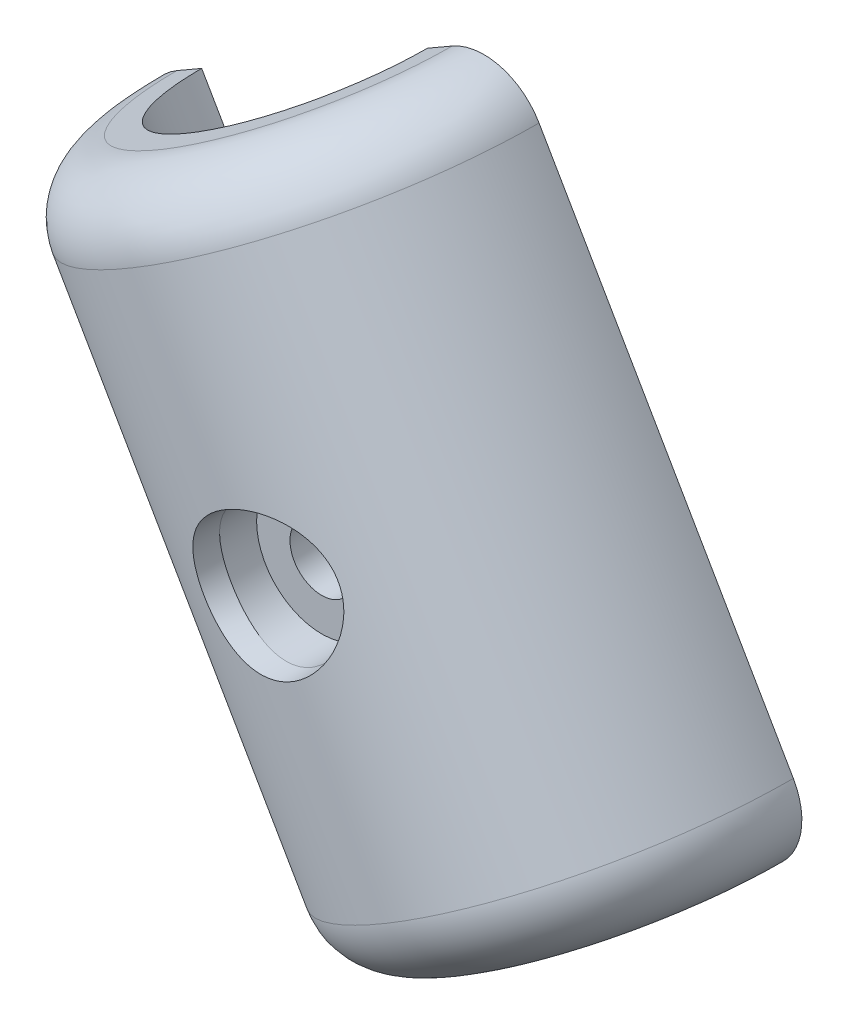
ISO-10303-21;
HEADER;
FILE_DESCRIPTION(('STEP AP214'),'2;1');
FILE_NAME('part.step','',(''),(''),'','','');
FILE_SCHEMA(('AUTOMOTIVE_DESIGN { 1 0 10303 214 1 1 1 1 }'));
ENDSEC;
DATA;
#1=APPLICATION_CONTEXT('core data for automotive mechanical design processes');
#2=APPLICATION_PROTOCOL_DEFINITION('international standard','automotive_design',2000,#1);
#3=PRODUCT_CONTEXT('',#1,'mechanical');
#4=PRODUCT('Part','Part','',(#3));
#5=PRODUCT_RELATED_PRODUCT_CATEGORY('part','',(#4));
#6=PRODUCT_DEFINITION_FORMATION('','',#4);
#7=PRODUCT_DEFINITION_CONTEXT('part definition',#1,'design');
#8=PRODUCT_DEFINITION('design','',#6,#7);
#9=PRODUCT_DEFINITION_SHAPE('','',#8);
#10=(LENGTH_UNIT() NAMED_UNIT(*) SI_UNIT(.MILLI.,.METRE.));
#11=(NAMED_UNIT(*) PLANE_ANGLE_UNIT() SI_UNIT($,.RADIAN.));
#12=(NAMED_UNIT(*) SI_UNIT($,.STERADIAN.) SOLID_ANGLE_UNIT());
#13=UNCERTAINTY_MEASURE_WITH_UNIT(LENGTH_MEASURE(1.E-05),#10,'distance_accuracy_value','');
#14=(GEOMETRIC_REPRESENTATION_CONTEXT(3) GLOBAL_UNCERTAINTY_ASSIGNED_CONTEXT((#13)) GLOBAL_UNIT_ASSIGNED_CONTEXT((#10,
#11,#12)) REPRESENTATION_CONTEXT('',''));
#15=CARTESIAN_POINT('',(0.,0.,0.));
#16=DIRECTION('',(0.,0.,1.));
#17=DIRECTION('',(1.,0.,0.));
#18=AXIS2_PLACEMENT_3D('',#15,#16,#17);
#19=CARTESIAN_POINT('',(0.,0.,8.02099309036844));
#20=DIRECTION('',(0.,0.,1.));
#21=DIRECTION('',(1.,0.,0.));
#22=AXIS2_PLACEMENT_3D('',#19,#20,#21);
#23=PLANE('',#22);
#24=DIRECTION('',(0.499999999999989,-0.866025403784445,0.));
#25=VECTOR('',#24,1.);
#26=CARTESIAN_POINT('',(-6.48868439169032,2.56315739652961,8.02099309036844));
#27=LINE('',#26,#25);
#28=CARTESIAN_POINT('',(1.24336641587843,-10.8291474488838,8.02099309036823));
#29=VERTEX_POINT('',#28);
#30=CARTESIAN_POINT('',(-8.75663358412135,6.49136062680508,8.0209930903685));
#31=VERTEX_POINT('',#30);
#32=EDGE_CURVE('E49',#29,#31,#27,.F.);
#33=ORIENTED_EDGE('',*,*,#32,.F.);
#34=DIRECTION('',(-0.866025403784445,-0.499999999999989,0.));
#35=VECTOR('',#34,1.);
#36=CARTESIAN_POINT('',(4.79407057139845,-8.77914744888168,8.02099309036844));
#37=LINE('',#36,#35);
#38=CARTESIAN_POINT('',(0.46394355247622,-11.2791474488816,8.02099309036833));
#39=VERTEX_POINT('',#38);
#40=EDGE_CURVE('E224',#29,#39,#37,.T.);
#41=ORIENTED_EDGE('',*,*,#40,.T.);
#42=CARTESIAN_POINT('',(-0.536056447523757,-9.54709664131274,8.02099309036833));
#43=DIRECTION('',(0.,0.,1.));
#44=DIRECTION('',(1.,0.,0.));
#45=AXIS2_PLACEMENT_3D('',#42,#43,#44);
#46=CIRCLE('',#45,2.);
#47=CARTESIAN_POINT('',(-2.26810725509265,-10.5470966413127,8.02099309036833));
#48=VERTEX_POINT('',#47);
#49=EDGE_CURVE('E54',#39,#48,#46,.F.);
#50=ORIENTED_EDGE('',*,*,#49,.T.);
#51=DIRECTION('',(0.499999999999989,-0.866025403784445,0.));
#52=VECTOR('',#51,1.);
#53=CARTESIAN_POINT('',(-11.2681072550924,5.0413606268073,8.02099309036844));
#54=LINE('',#53,#52);
#55=CARTESIAN_POINT('',(-10.2681072550925,3.30930981923841,8.02099309036855));
#56=VERTEX_POINT('',#55);
#57=EDGE_CURVE('E68',#48,#56,#54,.F.);
#58=ORIENTED_EDGE('',*,*,#57,.T.);
#59=CARTESIAN_POINT('',(-8.53605644752358,4.30930981923839,8.02099309036855));
#60=DIRECTION('',(0.,0.,1.));
#61=DIRECTION('',(1.,0.,0.));
#62=AXIS2_PLACEMENT_3D('',#59,#60,#61);
#63=CIRCLE('',#62,2.);
#64=CARTESIAN_POINT('',(-9.53605644752356,6.04136062680728,8.02099309036855));
#65=VERTEX_POINT('',#64);
#66=EDGE_CURVE('E227',#56,#65,#63,.F.);
#67=ORIENTED_EDGE('',*,*,#66,.T.);
#68=DIRECTION('',(-0.866025403784445,-0.499999999999989,0.));
#69=VECTOR('',#68,1.);
#70=CARTESIAN_POINT('',(-5.20592942860133,8.54136062680722,8.02099309036844));
#71=LINE('',#70,#69);
#72=EDGE_CURVE('E112',#31,#65,#71,.T.);
#73=ORIENTED_EDGE('',*,*,#72,.F.);
#74=EDGE_LOOP('',(#33,#41,#50,#58,#67,#73));
#75=FACE_BOUND('',#74,.T.);
#76=ADVANCED_FACE('F46',(#75),#23,.F.);
#77=CARTESIAN_POINT('',(0.124197590320872,9.30930981923827,8.02099309036855));
#78=DIRECTION('',(0.,0.,1.));
#79=DIRECTION('',(1.,0.,0.));
#80=AXIS2_PLACEMENT_3D('',#77,#78,#79);
#81=CIRCLE('',#80,2.);
#82=CARTESIAN_POINT('',(-0.875802409679106,11.0413606268072,8.02099309036855));
#83=VERTEX_POINT('',#82);
#84=CARTESIAN_POINT('',(1.85624839788976,10.3093098192383,8.02099309036855));
#85=VERTEX_POINT('',#84);
#86=EDGE_CURVE('E223',#83,#85,#81,.F.);
#87=ORIENTED_EDGE('',*,*,#86,.T.);
#88=DIRECTION('',(0.499999999999989,-0.866025403784445,0.));
#89=VECTOR('',#88,1.);
#90=CARTESIAN_POINT('',(0.856248397889784,12.0413606268071,8.02099309036844));
#91=LINE('',#90,#89);
#92=CARTESIAN_POINT('',(9.85624839788958,-3.54709664131287,8.02099309036833));
#93=VERTEX_POINT('',#92);
#94=EDGE_CURVE('E228',#85,#93,#91,.T.);
#95=ORIENTED_EDGE('',*,*,#94,.T.);
#96=CARTESIAN_POINT('',(8.12419759032069,-4.54709664131285,8.02099309036833));
#97=DIRECTION('',(0.,0.,1.));
#98=DIRECTION('',(1.,0.,0.));
#99=AXIS2_PLACEMENT_3D('',#96,#97,#98);
#100=CIRCLE('',#99,2.);
#101=CARTESIAN_POINT('',(9.12419759032067,-6.27914744888174,8.02099309036833));
#102=VERTEX_POINT('',#101);
#103=EDGE_CURVE('E11',#93,#102,#100,.F.);
#104=ORIENTED_EDGE('',*,*,#103,.T.);
#105=CARTESIAN_POINT('',(8.34477472691846,-6.72914744887954,8.02099309036823));
#106=VERTEX_POINT('',#105);
#107=EDGE_CURVE('E117',#102,#106,#37,.T.);
#108=ORIENTED_EDGE('',*,*,#107,.T.);
#109=DIRECTION('',(0.499999999999989,-0.866025403784445,0.));
#110=VECTOR('',#109,1.);
#111=CARTESIAN_POINT('',(0.612723919349714,6.6631573965339,8.02099309036844));
#112=LINE('',#111,#110);
#113=CARTESIAN_POINT('',(-1.65522527308131,10.5913606268094,8.0209930903685));
#114=VERTEX_POINT('',#113);
#115=EDGE_CURVE('E115',#114,#106,#112,.T.);
#116=ORIENTED_EDGE('',*,*,#115,.F.);
#117=EDGE_CURVE('E102',#83,#114,#71,.T.);
#118=ORIENTED_EDGE('',*,*,#117,.F.);
#119=EDGE_LOOP('',(#87,#95,#104,#108,#116,#118));
#120=FACE_BOUND('',#119,.T.);
#121=ADVANCED_FACE('F116',(#120),#23,.F.);
#122=CARTESIAN_POINT('',(-5.20592942860133,8.54136062680722,8.02099309036857));
#123=DIRECTION('',(0.499999999999989,-0.866025403784445,0.));
#124=DIRECTION('',(0.866025403784445,0.499999999999989,0.));
#125=AXIS2_PLACEMENT_3D('',#122,#123,#124);
#126=CYLINDRICAL_SURFACE('',#125,7.);
#127=ORIENTED_EDGE('',*,*,#57,.F.);
#128=CARTESIAN_POINT('',(3.79407057139847,-7.04709664131279,8.02099309036833));
#129=DIRECTION('',(0.499999999999989,-0.866025403784445,0.));
#130=DIRECTION('',(0.866025403784445,0.499999999999989,0.));
#131=AXIS2_PLACEMENT_3D('',#128,#129,#130);
#132=CIRCLE('',#131,7.);
#133=EDGE_CURVE('E210',#48,#93,#132,.F.);
#134=ORIENTED_EDGE('',*,*,#133,.T.);
#135=ORIENTED_EDGE('',*,*,#94,.F.);
#136=CARTESIAN_POINT('',(-4.20592942860135,6.80930981923833,8.02099309036855));
#137=DIRECTION('',(0.499999999999989,-0.866025403784445,0.));
#138=DIRECTION('',(0.866025403784445,0.499999999999989,0.));
#139=AXIS2_PLACEMENT_3D('',#136,#137,#138);
#140=CIRCLE('',#139,7.);
#141=EDGE_CURVE('E217',#85,#56,#140,.T.);
#142=ORIENTED_EDGE('',*,*,#141,.T.);
#143=EDGE_LOOP('',(#127,#134,#135,#142));
#144=FACE_BOUND('',#143,.T.);
#145=CARTESIAN_POINT('',(2.20728780286052,-0.390815341899038,14.7427557478983));
#146=CARTESIAN_POINT('',(2.24765655342599,-0.252381603376757,14.7124725103386));
#147=CARTESIAN_POINT('',(2.27362633488919,-0.11339552787585,14.6831402458887));
#148=CARTESIAN_POINT('',(2.29755991770431,0.166106999581036,14.6291970885458));
#149=CARTESIAN_POINT('',(2.29523278737525,0.308160803132168,14.6043731594933));
#150=CARTESIAN_POINT('',(2.2612931511112,0.584843539168166,14.5639675581829));
#151=CARTESIAN_POINT('',(2.23008166314934,0.719684432432771,14.5482633544893));
#152=CARTESIAN_POINT('',(2.13834998678215,0.982340143072476,14.5279226816283));
#153=CARTESIAN_POINT('',(2.07782413022101,1.108952595355,14.5235350806048));
#154=CARTESIAN_POINT('',(1.9326883129479,1.34315844847134,14.5269515726657));
#155=CARTESIAN_POINT('',(1.84704129093022,1.45284020137395,14.534696763413));
#156=CARTESIAN_POINT('',(1.65196740526116,1.65302444257651,14.5613763706955));
#157=CARTESIAN_POINT('',(1.5451652672079,1.74110663115862,14.5798790400753));
#158=CARTESIAN_POINT('',(1.31389229399296,1.89477524576524,14.6246134921685));
#159=CARTESIAN_POINT('',(1.18788537389544,1.96087623228451,14.6511944208678));
#160=CARTESIAN_POINT('',(0.92558406323005,2.06613767718597,14.7078032046467));
#161=CARTESIAN_POINT('',(0.789595785378439,2.10562030551738,14.7377235879709));
#162=CARTESIAN_POINT('',(0.507560505642371,2.15876596410911,14.7979135476689));
#163=CARTESIAN_POINT('',(0.36073636181593,2.17215125230682,14.8283070073759));
#164=CARTESIAN_POINT('',(0.0680596747865419,2.17131383083772,14.884367719768));
#165=CARTESIAN_POINT('',(-0.0791637181976496,2.15749690006329,14.9103582347315));
#166=CARTESIAN_POINT('',(-0.375840246732565,2.10170958788396,14.9559143919653));
#167=CARTESIAN_POINT('',(-0.521629792106473,2.06030830716745,14.9748739215937));
#168=CARTESIAN_POINT('',(-0.804860177805445,1.95181320507357,15.003520805999));
#169=CARTESIAN_POINT('',(-0.944440048019657,1.88356831875083,15.013326249379));
#170=CARTESIAN_POINT('',(-1.20670000944791,1.72460792262793,15.0224565779073));
#171=CARTESIAN_POINT('',(-1.3293671427521,1.63438489371017,15.0219270276929));
#172=CARTESIAN_POINT('',(-1.55785608472469,1.43255023903682,15.0114335683124));
#173=CARTESIAN_POINT('',(-1.66366774631007,1.32033773325938,15.0013099049189));
#174=CARTESIAN_POINT('',(-1.84844019147616,1.08475136557406,14.9741247495024));
#175=CARTESIAN_POINT('',(-1.92890189689418,0.960220033284945,14.9570282777137));
#176=CARTESIAN_POINT('',(-2.06566215532409,0.697238910843063,14.9180914422551));
#177=CARTESIAN_POINT('',(-2.12046580859277,0.561269955570934,14.8966239761833));
#178=CARTESIAN_POINT('',(-2.20183981442923,0.285752031453114,14.8534203173411));
#179=CARTESIAN_POINT('',(-2.22893953816625,0.144147022580103,14.8313667233213));
#180=CARTESIAN_POINT('',(-2.2536760856964,-0.139315031371491,14.7904689319882));
#181=CARTESIAN_POINT('',(-2.25143025322856,-0.279453374193693,14.7718684336162));
#182=CARTESIAN_POINT('',(-2.21783081141071,-0.556822109969732,14.740848642437));
#183=CARTESIAN_POINT('',(-2.18587159249897,-0.694890296272253,14.7284520551673));
#184=CARTESIAN_POINT('',(-2.09461292960682,-0.956218564948801,14.7128191533221));
#185=CARTESIAN_POINT('',(-2.035333301034,-1.08094388091032,14.7093717589949));
#186=CARTESIAN_POINT('',(-1.88857038539896,-1.31814064066901,14.7119912246161));
#187=CARTESIAN_POINT('',(-1.80255068574924,-1.4278600640568,14.7180882022065));
#188=CARTESIAN_POINT('',(-1.60969163613893,-1.62595105428852,14.7383899622264));
#189=CARTESIAN_POINT('',(-1.5013221884031,-1.715770788285,14.7527651885281));
#190=CARTESIAN_POINT('',(-1.26647994119128,-1.87148036591194,14.7873129331859));
#191=CARTESIAN_POINT('',(-1.14184443668187,-1.93650263727494,14.8071590625043));
#192=CARTESIAN_POINT('',(-0.87832085102431,-2.04184091788467,14.8492347883861));
#193=CARTESIAN_POINT('',(-0.737966468533625,-2.08225636462668,14.8716872795438));
#194=CARTESIAN_POINT('',(-0.452738049990774,-2.1347695526851,14.9144782638256));
#195=CARTESIAN_POINT('',(-0.307147802071598,-2.14744946211726,14.934952011843));
#196=CARTESIAN_POINT('',(-0.00953273436393934,-2.14508557758922,14.9712752276687));
#197=CARTESIAN_POINT('',(0.141141669395922,-2.12974448125676,14.9868808736117));
#198=CARTESIAN_POINT('',(0.436662671744857,-2.0719873338476,15.0098393491016));
#199=CARTESIAN_POINT('',(0.584226672044233,-2.02906732461914,15.017403514726));
#200=CARTESIAN_POINT('',(0.870228027931225,-1.91674794594272,15.0225639504106));
#201=CARTESIAN_POINT('',(1.00662793522853,-1.84843502635996,15.0202073815121));
#202=CARTESIAN_POINT('',(1.2665498059268,-1.6881222203428,15.0054523441415));
#203=CARTESIAN_POINT('',(1.39103891136309,-1.59494797778121,14.9928060421209));
#204=CARTESIAN_POINT('',(1.61607377106842,-1.3927672972956,14.9590599480154));
#205=CARTESIAN_POINT('',(1.7179601274762,-1.28322248500527,14.9379787417406));
#206=CARTESIAN_POINT('',(1.90074466551516,-1.04718887626352,14.8889848289423));
#207=CARTESIAN_POINT('',(1.98083418135631,-0.921191707064219,14.8611489208931));
#208=CARTESIAN_POINT('',(2.11339924672332,-0.662854336893716,14.8033140836572));
#209=CARTESIAN_POINT('',(2.16691905229506,-0.529249080421318,14.773038985458));
#210=CARTESIAN_POINT('',(2.20728780286052,-0.390815341899038,14.7427557478983));
#211=B_SPLINE_CURVE_WITH_KNOTS('',3,(#145,#146,#147,#148,#149,#150,#151,#152,#153,#154,#155,
#156,#157,#158,#159,#160,#161,#162,#163,#164,#165,#166,#167,#168,#169,#170,#171,#172,#173,#174,
#175,#176,#177,#178,#179,#180,#181,#182,#183,#184,#185,#186,#187,#188,#189,#190,#191,#192,#193,
#194,#195,#196,#197,#198,#199,#200,#201,#202,#203,#204,#205,#206,#207,#208,#209,#210),
.UNSPECIFIED.,.T.,.F.,(4,2,2,2,2,2,2,2,2,2,2,2,2,2,2,2,2,2,2,2,2,2,2,2,2,2,2,2,2,2,2,2,4),
(-0.00628336958364831,-0.0058696141703498,-0.00545585875705129,-0.00504210334375278,
-0.00462834793045427,-0.00421459251715576,-0.00380083710385724,-0.00338708169055873,
-0.00297332627726022,-0.00255957086396171,-0.0021458154506632,-0.00173206003736469,
-0.00131830462406618,-0.00090454921076767,-0.00049079379746916,-7.70383841706495E-05,
0.000336717029127861,0.000750472442426371,0.00116422785572488,0.00157798326902339,
0.0019917386823219,0.00240549409562041,0.00281924950891892,0.00323300492221743,
0.00364676033551595,0.00406051574881446,0.00447427116211297,0.00488802657541148,
0.00530178198870999,0.0057155374020085,0.00612929281530701,0.00654304822860552,
0.00695680364190403),.UNSPECIFIED.);
#212=CARTESIAN_POINT('',(2.20728780286052,-0.390815341899038,14.7427557478983));
#213=VERTEX_POINT('',#212);
#214=EDGE_CURVE('E130',#213,#213,#211,.F.);
#215=ORIENTED_EDGE('',*,*,#214,.T.);
#216=EDGE_LOOP('',(#215));
#217=FACE_BOUND('',#216,.T.);
#218=ADVANCED_FACE('F162',(#144,#217),#126,.T.);
#219=CARTESIAN_POINT('',(-5.20592942860133,8.54136062680722,8.02099309036857));
#220=DIRECTION('',(0.499999999999989,-0.866025403784445,0.));
#221=DIRECTION('',(0.866025403784445,0.499999999999989,0.));
#222=AXIS2_PLACEMENT_3D('',#219,#220,#221);
#223=PLANE('',#222);
#224=CARTESIAN_POINT('',(-5.20592942860133,8.54136062680722,8.02099309036857));
#225=DIRECTION('',(0.499999999999989,-0.866025403784445,0.));
#226=DIRECTION('',(0.866025403784445,0.499999999999989,0.));
#227=AXIS2_PLACEMENT_3D('',#224,#225,#226);
#228=CIRCLE('',#227,5.);
#229=EDGE_CURVE('E108',#65,#83,#228,.F.);
#230=ORIENTED_EDGE('',*,*,#229,.T.);
#231=ORIENTED_EDGE('',*,*,#117,.T.);
#232=CARTESIAN_POINT('',(-5.20592942860133,8.54136062680722,8.02099309036857));
#233=DIRECTION('',(0.499999999999989,-0.866025403784445,0.));
#234=DIRECTION('',(0.866025403784445,0.499999999999989,0.));
#235=AXIS2_PLACEMENT_3D('',#232,#233,#234);
#236=CIRCLE('',#235,4.1);
#237=EDGE_CURVE('E106',#114,#31,#236,.T.);
#238=ORIENTED_EDGE('',*,*,#237,.T.);
#239=ORIENTED_EDGE('',*,*,#72,.T.);
#240=EDGE_LOOP('',(#230,#231,#238,#239));
#241=FACE_BOUND('',#240,.T.);
#242=ADVANCED_FACE('F104',(#241),#223,.F.);
#243=CARTESIAN_POINT('',(4.79407057139845,-8.77914744888168,8.0209930903683));
#244=DIRECTION('',(0.499999999999989,-0.866025403784445,0.));
#245=DIRECTION('',(0.866025403784445,0.499999999999989,0.));
#246=AXIS2_PLACEMENT_3D('',#243,#244,#245);
#247=PLANE('',#246);
#248=ORIENTED_EDGE('',*,*,#107,.F.);
#249=CARTESIAN_POINT('',(4.79407057139845,-8.77914744888168,8.0209930903683));
#250=DIRECTION('',(0.499999999999989,-0.866025403784445,0.));
#251=DIRECTION('',(0.866025403784445,0.499999999999989,0.));
#252=AXIS2_PLACEMENT_3D('',#249,#250,#251);
#253=CIRCLE('',#252,5.);
#254=EDGE_CURVE('E121',#102,#39,#253,.T.);
#255=ORIENTED_EDGE('',*,*,#254,.T.);
#256=ORIENTED_EDGE('',*,*,#40,.F.);
#257=CARTESIAN_POINT('',(4.79407057139845,-8.77914744888168,8.0209930903683));
#258=DIRECTION('',(0.499999999999989,-0.866025403784445,0.));
#259=DIRECTION('',(0.866025403784445,0.499999999999989,0.));
#260=AXIS2_PLACEMENT_3D('',#257,#258,#259);
#261=CIRCLE('',#260,4.1);
#262=EDGE_CURVE('E127',#106,#29,#261,.T.);
#263=ORIENTED_EDGE('',*,*,#262,.F.);
#264=EDGE_LOOP('',(#248,#255,#256,#263));
#265=FACE_BOUND('',#264,.T.);
#266=ADVANCED_FACE('F157',(#265),#247,.T.);
#267=CARTESIAN_POINT('',(-2.9379802361703,4.61315739653176,8.02099309036851));
#268=DIRECTION('',(0.499999999999989,-0.866025403784445,0.));
#269=DIRECTION('',(0.866025403784445,0.499999999999989,0.));
#270=AXIS2_PLACEMENT_3D('',#267,#268,#269);
#271=CYLINDRICAL_SURFACE('',#270,4.10000000000438);
#272=CARTESIAN_POINT('',(-1.,0.,12.0725750387544));
#273=CARTESIAN_POINT('',(-0.999998640165405,-0.0555553926062376,12.0682685105987));
#274=CARTESIAN_POINT('',(-0.995358681675999,-0.111153837738184,12.0642916947516));
#275=CARTESIAN_POINT('',(-0.976884198853626,-0.220897395404785,12.0575643679716));
#276=CARTESIAN_POINT('',(-0.963046039461312,-0.275041924558119,12.0548143425754));
#277=CARTESIAN_POINT('',(-0.926520267984789,-0.380350453722287,12.050934213533));
#278=CARTESIAN_POINT('',(-0.903829230901465,-0.431513291361236,12.0498047376368));
#279=CARTESIAN_POINT('',(-0.850238731675933,-0.529343400707557,12.0493311492704));
#280=CARTESIAN_POINT('',(-0.819340328794739,-0.576011251489667,12.049986806508));
#281=CARTESIAN_POINT('',(-0.750530902282833,-0.663143514314282,12.0529751898221));
#282=CARTESIAN_POINT('',(-0.71268145889525,-0.703657097545359,12.0552936715555));
#283=CARTESIAN_POINT('',(-0.630877589502905,-0.777845208759872,12.0612649313867));
#284=CARTESIAN_POINT('',(-0.586922614399659,-0.811519120948867,12.064917829543));
#285=CARTESIAN_POINT('',(-0.493706088625943,-0.871407453360232,12.0730839720123));
#286=CARTESIAN_POINT('',(-0.444400419475157,-0.89755215405224,12.0776046494182));
#287=CARTESIAN_POINT('',(-0.342145869002344,-0.941291215075691,12.0868403036719));
#288=CARTESIAN_POINT('',(-0.28919662971585,-0.958884733918713,12.0915552995922));
#289=CARTESIAN_POINT('',(-0.180319799604247,-0.985223004340487,12.1005488288591));
#290=CARTESIAN_POINT('',(-0.124361174151115,-0.993842187586795,12.1048204347345));
#291=CARTESIAN_POINT('',(-0.0117115341582261,-1.00152349773239,12.1121557719963));
#292=CARTESIAN_POINT('',(0.0449794273021484,-1.00058631343427,12.115219590421));
#293=CARTESIAN_POINT('',(0.156954518496473,-0.989193309289445,12.1195294906937));
#294=CARTESIAN_POINT('',(0.212246722984275,-0.978823362552333,12.1207917079343));
#295=CARTESIAN_POINT('',(0.320316681920232,-0.94896713956621,12.1211496646835));
#296=CARTESIAN_POINT('',(0.373094823964313,-0.929482273619674,12.1202457392586));
#297=CARTESIAN_POINT('',(0.47352051652556,-0.882490068807805,12.1161487091364));
#298=CARTESIAN_POINT('',(0.52125139927447,-0.855156377880132,12.1130031758049));
#299=CARTESIAN_POINT('',(0.611469732895113,-0.793158773044733,12.1045621180753));
#300=CARTESIAN_POINT('',(0.653957127011889,-0.75849477980562,12.0992665704086));
#301=CARTESIAN_POINT('',(0.732673305456909,-0.682774128561667,12.0868250447851));
#302=CARTESIAN_POINT('',(0.768885953356873,-0.641701490004743,12.0796744106324));
#303=CARTESIAN_POINT('',(0.834048219821672,-0.554376282103432,12.0640376240422));
#304=CARTESIAN_POINT('',(0.862996574397156,-0.508122813315228,12.0555512396011));
#305=CARTESIAN_POINT('',(0.913707051153818,-0.410205455663817,12.0376291540995));
#306=CARTESIAN_POINT('',(0.935230784951579,-0.358421850041042,12.0281727730164));
#307=CARTESIAN_POINT('',(0.969348037613307,-0.251971063525043,12.0093347373275));
#308=CARTESIAN_POINT('',(0.981939993434982,-0.197303379721697,11.9999530960848));
#309=CARTESIAN_POINT('',(0.997977329279118,-0.0854129263032851,11.9819395788224));
#310=CARTESIAN_POINT('',(1.00124285480782,-0.0281612708445607,11.9733255104593));
#311=CARTESIAN_POINT('',(0.997911810425009,0.0863044140842949,11.9579233260544));
#312=CARTESIAN_POINT('',(0.991317083789819,0.143518448587102,11.9511348690125));
#313=CARTESIAN_POINT('',(0.968611736963303,0.254829402797865,11.9402565111246));
#314=CARTESIAN_POINT('',(0.952737618581616,0.308968329883195,11.936104713786));
#315=CARTESIAN_POINT('',(0.912048277722974,0.413924167111951,11.9307031300445));
#316=CARTESIAN_POINT('',(0.887235715955091,0.464742060515922,11.9294524808794));
#317=CARTESIAN_POINT('',(0.830588583979473,0.559506301713356,11.9299826021627));
#318=CARTESIAN_POINT('',(0.799077120874682,0.603646985278685,11.9316432952846));
#319=CARTESIAN_POINT('',(0.729450299449352,0.686160723389039,11.9375891028435));
#320=CARTESIAN_POINT('',(0.691334844704219,0.724533693704655,11.9418742556024));
#321=CARTESIAN_POINT('',(0.609616834205314,0.79452019907902,11.9526338209671));
#322=CARTESIAN_POINT('',(0.566014173945161,0.826133605367772,11.959108275273));
#323=CARTESIAN_POINT('',(0.474504755925245,0.881882892553441,11.9736312082089));
#324=CARTESIAN_POINT('',(0.426597118254251,0.906017240271271,11.9816800090232));
#325=CARTESIAN_POINT('',(0.325711110380621,0.947098191020722,11.9989789651414));
#326=CARTESIAN_POINT('',(0.272606912193688,0.963721210997016,12.0082641404188));
#327=CARTESIAN_POINT('',(0.16439289310993,0.987952729631303,12.0269441314271));
#328=CARTESIAN_POINT('',(0.1092827020671,0.99555955584009,12.0363389671731));
#329=CARTESIAN_POINT('',(-0.00305210741812303,1.00161776114565,12.054693250144));
#330=CARTESIAN_POINT('',(-0.0602936855444184,0.99981690441857,12.0636341429448));
#331=CARTESIAN_POINT('',(-0.173839297353223,0.986431253944925,12.0800441217097));
#332=CARTESIAN_POINT('',(-0.230143436714798,0.974847570753141,12.0875133746168));
#333=CARTESIAN_POINT('',(-0.339255662048411,0.942386259113005,12.1002923448912));
#334=CARTESIAN_POINT('',(-0.392105831324602,0.921663532501717,12.1056353441136));
#335=CARTESIAN_POINT('',(-0.493679811800428,0.871485595465624,12.1139991685075));
#336=CARTESIAN_POINT('',(-0.542404511394337,0.842032271301149,12.1170204947744));
#337=CARTESIAN_POINT('',(-0.632815876192379,0.776256928947735,12.1206195197343));
#338=CARTESIAN_POINT('',(-0.674671048599559,0.740170048463332,12.1212684800861));
#339=CARTESIAN_POINT('',(-0.751867124212478,0.661610548307793,12.1205057701526));
#340=CARTESIAN_POINT('',(-0.787207456926787,0.619137369992106,12.1190939195025));
#341=CARTESIAN_POINT('',(-0.850288221145004,0.529169177295981,12.1146131917309));
#342=CARTESIAN_POINT('',(-0.878052345616093,0.481690477678649,12.111549571726));
#343=CARTESIAN_POINT('',(-0.925404707393408,0.382915015576701,12.1043177002133));
#344=CARTESIAN_POINT('',(-0.944995959765587,0.331619669340487,12.1001498569956));
#345=CARTESIAN_POINT('',(-0.973423408368011,0.233821155091022,12.0919546451336));
#346=CARTESIAN_POINT('',(-0.983369617317248,0.187631631133391,12.0879870580507));
#347=CARTESIAN_POINT('',(-0.996658584294474,0.0943051008305059,12.0801254346757));
#348=CARTESIAN_POINT('',(-1.00000115453725,0.0471680675797855,12.0762314004782));
#349=CARTESIAN_POINT('',(-1.,0.,12.0725750387544));
#350=B_SPLINE_CURVE_WITH_KNOTS('',3,(#272,#273,#274,#275,#276,#277,#278,#279,#280,#281,#282,
#283,#284,#285,#286,#287,#288,#289,#290,#291,#292,#293,#294,#295,#296,#297,#298,#299,#300,#301,
#302,#303,#304,#305,#306,#307,#308,#309,#310,#311,#312,#313,#314,#315,#316,#317,#318,#319,#320,
#321,#322,#323,#324,#325,#326,#327,#328,#329,#330,#331,#332,#333,#334,#335,#336,#337,#338,#339,
#340,#341,#342,#343,#344,#345,#346,#347,#348,#349),.UNSPECIFIED.,.T.,.F.,(4,2,2,2,2,2,2,2,2,2,2,
2,2,2,2,2,2,2,2,2,2,2,2,2,2,2,2,2,2,2,2,2,2,2,2,2,2,2,4),(0.,0.167000313855698,
0.334066664240361,0.501197713408606,0.668307202741109,0.834002013880799,0.999711736375053,
1.1669098982425,1.3341245100988,1.50364856155348,1.67316039416257,1.84114431856704,
2.00910226031385,2.17359805329736,2.33809562660953,2.50301014585093,2.66795334040504,
2.83778464468082,3.007645661749,3.18076092525977,3.35384383063556,3.52269669094154,
3.69149933024336,3.85350254763533,4.01550813062862,4.17751679956062,4.33955865772904,
4.50803698930717,4.67654656770456,4.84959698011624,5.02262775033814,5.19283216415719,
5.36299983179483,5.52801190141367,5.69303841395126,5.85754276765499,6.02198638003972,
6.16377024173542,6.30555813522799),.UNSPECIFIED.);
#351=CARTESIAN_POINT('',(-1.,0.,12.0725750387544));
#352=VERTEX_POINT('',#351);
#353=EDGE_CURVE('E131',#352,#352,#350,.T.);
#354=ORIENTED_EDGE('',*,*,#353,.T.);
#355=EDGE_LOOP('',(#354));
#356=FACE_BOUND('',#355,.T.);
#357=ORIENTED_EDGE('',*,*,#262,.T.);
#358=ORIENTED_EDGE('',*,*,#32,.T.);
#359=ORIENTED_EDGE('',*,*,#237,.F.);
#360=ORIENTED_EDGE('',*,*,#115,.T.);
#361=EDGE_LOOP('',(#357,#358,#359,#360));
#362=FACE_BOUND('',#361,.T.);
#363=ADVANCED_FACE('F124',(#356,#362),#271,.F.);
#364=CARTESIAN_POINT('',(0.,0.,15.0209930903686));
#365=DIRECTION('',(0.,0.,-1.));
#366=DIRECTION('',(-1.,0.,0.));
#367=AXIS2_PLACEMENT_3D('',#364,#365,#366);
#368=CYLINDRICAL_SURFACE('',#367,1.);
#369=CARTESIAN_POINT('',(0.,0.,13.));
#370=DIRECTION('',(0.,0.,-1.));
#371=DIRECTION('',(-1.,0.,0.));
#372=AXIS2_PLACEMENT_3D('',#369,#370,#371);
#373=CIRCLE('',#372,1.);
#374=CARTESIAN_POINT('',(-1.,0.,13.));
#375=VERTEX_POINT('',#374);
#376=EDGE_CURVE('E142',#375,#375,#373,.F.);
#377=ORIENTED_EDGE('',*,*,#376,.T.);
#378=EDGE_LOOP('',(#377));
#379=FACE_BOUND('',#378,.T.);
#380=ORIENTED_EDGE('',*,*,#353,.F.);
#381=EDGE_LOOP('',(#380));
#382=FACE_BOUND('',#381,.T.);
#383=ADVANCED_FACE('F147',(#379,#382),#368,.F.);
#384=CARTESIAN_POINT('',(0.,0.,13.));
#385=DIRECTION('',(0.,0.,-1.));
#386=DIRECTION('',(-1.,0.,0.));
#387=AXIS2_PLACEMENT_3D('',#384,#385,#386);
#388=PLANE('',#387);
#389=CARTESIAN_POINT('',(0.,0.,13.));
#390=DIRECTION('',(0.,0.,-1.));
#391=DIRECTION('',(-1.,0.,0.));
#392=AXIS2_PLACEMENT_3D('',#389,#390,#391);
#393=CIRCLE('',#392,2.05);
#394=CARTESIAN_POINT('',(-2.05,0.,13.));
#395=VERTEX_POINT('',#394);
#396=EDGE_CURVE('E324',#395,#395,#393,.T.);
#397=ORIENTED_EDGE('',*,*,#396,.F.);
#398=EDGE_LOOP('',(#397));
#399=FACE_BOUND('',#398,.T.);
#400=ORIENTED_EDGE('',*,*,#376,.F.);
#401=EDGE_LOOP('',(#400));
#402=FACE_BOUND('',#401,.T.);
#403=ADVANCED_FACE('F152',(#399,#402),#388,.F.);
#404=CARTESIAN_POINT('',(0.,0.,15.5));
#405=DIRECTION('',(0.,0.,-1.));
#406=DIRECTION('',(-1.,0.,0.));
#407=AXIS2_PLACEMENT_3D('',#404,#405,#406);
#408=CYLINDRICAL_SURFACE('',#407,2.05);
#409=CARTESIAN_POINT('',(1.99459515730765,-0.473381620307396,14.094046086596));
#410=CARTESIAN_POINT('',(1.96369841016439,-0.603565175360707,14.1214067209906));
#411=CARTESIAN_POINT('',(1.92070033692532,-0.728614290069813,14.1487600086283));
#412=CARTESIAN_POINT('',(1.81123653258014,-0.969221745013001,14.2010132669451));
#413=CARTESIAN_POINT('',(1.74387712442718,-1.08594220517167,14.2261627668149));
#414=CARTESIAN_POINT('',(1.58804477149313,-1.30326194673476,14.2704283302617));
#415=CARTESIAN_POINT('',(1.50028379186387,-1.40342603199493,14.2894750161296));
#416=CARTESIAN_POINT('',(1.30482565219306,-1.58678483128287,14.3199643101013));
#417=CARTESIAN_POINT('',(1.19593692272917,-1.67043756315964,14.3313901332138));
#418=CARTESIAN_POINT('',(0.967191457870689,-1.81250309224111,14.3447211791343));
#419=CARTESIAN_POINT('',(0.846507149183307,-1.87199478274313,14.3468503179528));
#420=CARTESIAN_POINT('',(0.59219719586682,-1.96729288654318,14.3421879102303));
#421=CARTESIAN_POINT('',(0.46037155516753,-2.00214775843716,14.3353537518562));
#422=CARTESIAN_POINT('',(0.195219310043776,-2.04509829504803,14.3146109760326));
#423=CARTESIAN_POINT('',(0.0594534469635571,-2.05356306182396,14.300511408837));
#424=CARTESIAN_POINT('',(-0.2098532923358,-2.04367745912595,14.267693710632));
#425=CARTESIAN_POINT('',(-0.342159637306033,-2.02566528588449,14.2491958557598));
#426=CARTESIAN_POINT('',(-0.602491782061877,-1.96402564147895,14.2105345851705));
#427=CARTESIAN_POINT('',(-0.731189639518298,-1.91981456493655,14.1902489536564));
#428=CARTESIAN_POINT('',(-0.974028626798277,-1.80875495489546,14.15223391309));
#429=CARTESIAN_POINT('',(-1.08950111419693,-1.7417519300511,14.1343031068444));
#430=CARTESIAN_POINT('',(-1.30843170332032,-1.58389360167259,14.1030895293221));
#431=CARTESIAN_POINT('',(-1.41019128598956,-1.49393939910734,14.0901016367675));
#432=CARTESIAN_POINT('',(-1.59284671277463,-1.29743352079756,14.071759178816));
#433=CARTESIAN_POINT('',(-1.67518666619505,-1.18944036304316,14.0662506122774));
#434=CARTESIAN_POINT('',(-1.81771029090113,-0.957574040054384,14.0638839486065));
#435=CARTESIAN_POINT('',(-1.87645689312528,-0.836381300192778,14.066998639585));
#436=CARTESIAN_POINT('',(-1.96972178474097,-0.583798117320028,14.0811228260599));
#437=CARTESIAN_POINT('',(-2.00428189136959,-0.451013148697709,14.0923230354097));
#438=CARTESIAN_POINT('',(-2.04600739703396,-0.185506042091878,14.1203491384621));
#439=CARTESIAN_POINT('',(-2.05375516878683,-0.05196138289865,14.1371545280828));
#440=CARTESIAN_POINT('',(-2.04292303995703,0.216969425136598,14.1741053151935));
#441=CARTESIAN_POINT('',(-2.02416682831254,0.350714074588051,14.194030546873));
#442=CARTESIAN_POINT('',(-1.96174213157948,0.60977005513639,14.2330646649105));
#443=CARTESIAN_POINT('',(-1.91767830420914,0.737017755042695,14.252460334541));
#444=CARTESIAN_POINT('',(-1.80460635066877,0.981876351079177,14.2876394166801));
#445=CARTESIAN_POINT('',(-1.73685025753671,1.09718572371939,14.3030859313607));
#446=CARTESIAN_POINT('',(-1.57920020335204,1.31399849587883,14.3276474741981));
#447=CARTESIAN_POINT('',(-1.48799479966788,1.41654294026869,14.3367941170572));
#448=CARTESIAN_POINT('',(-1.28939588693136,1.59943135902364,14.3462748634125));
#449=CARTESIAN_POINT('',(-1.18203606919808,1.68034796430207,14.3467533086726));
#450=CARTESIAN_POINT('',(-0.951119000528345,1.82103025698458,14.3385041362949));
#451=CARTESIAN_POINT('',(-0.827553393701686,1.88032748181618,14.3296450048276));
#452=CARTESIAN_POINT('',(-0.575595785120561,1.97209673962811,14.3037628006109));
#453=CARTESIAN_POINT('',(-0.44531446093207,2.00557770091821,14.2866330302557));
#454=CARTESIAN_POINT('',(-0.179035894936132,2.04660524573255,14.2454734505927));
#455=CARTESIAN_POINT('',(-0.0463317551576352,2.05375928876247,14.2219912463063));
#456=CARTESIAN_POINT('',(0.218566978424197,2.04262143424978,14.1713408934026));
#457=CARTESIAN_POINT('',(0.352019019594767,2.02388721355566,14.1438806673221));
#458=CARTESIAN_POINT('',(0.609486505399923,1.96177548233378,14.0894995772802));
#459=CARTESIAN_POINT('',(0.734194094776826,1.91863077326124,14.0624667713807));
#460=CARTESIAN_POINT('',(0.975923539593555,1.80769418259211,14.0113212411131));
#461=CARTESIAN_POINT('',(1.09268143150081,1.73960797573312,13.987305603511));
#462=CARTESIAN_POINT('',(1.30829785725871,1.58383879756533,13.9468884263585));
#463=CARTESIAN_POINT('',(1.40856784287175,1.49560316579494,13.9301714254367));
#464=CARTESIAN_POINT('',(1.5933135210382,1.29701357787229,13.9060666389752));
#465=CARTESIAN_POINT('',(1.67531458343372,1.18907148782275,13.8990689264635));
#466=CARTESIAN_POINT('',(1.81624338362602,0.960119746726106,13.8959821564755));
#467=CARTESIAN_POINT('',(1.87619503746325,0.837079074523077,13.8999463158649));
#468=CARTESIAN_POINT('',(1.96994223132661,0.583212483441579,13.9183239317416));
#469=CARTESIAN_POINT('',(2.00369387896408,0.453531343776708,13.9325125433368));
#470=CARTESIAN_POINT('',(2.04569936006097,0.188663638871253,13.9690186424299));
#471=CARTESIAN_POINT('',(2.05359883608121,0.0532915799382641,13.9914468463418));
#472=CARTESIAN_POINT('',(2.0433320817784,-0.211901334638408,14.0401840066411));
#473=CARTESIAN_POINT('',(2.02549190445092,-0.343198065254084,14.0666854522013));
#474=CARTESIAN_POINT('',(1.99459515730765,-0.473381620307396,14.094046086596));
#475=B_SPLINE_CURVE_WITH_KNOTS('',3,(#409,#410,#411,#412,#413,#414,#415,#416,#417,#418,#419,
#420,#421,#422,#423,#424,#425,#426,#427,#428,#429,#430,#431,#432,#433,#434,#435,#436,#437,#438,
#439,#440,#441,#442,#443,#444,#445,#446,#447,#448,#449,#450,#451,#452,#453,#454,#455,#456,#457,
#458,#459,#460,#461,#462,#463,#464,#465,#466,#467,#468,#469,#470,#471,#472,#473,#474),
.UNSPECIFIED.,.T.,.F.,(4,2,2,2,2,2,2,2,2,2,2,2,2,2,2,2,2,2,2,2,2,2,2,2,2,2,2,2,2,2,2,2,4),
(-0.00628336958364831,-0.0058696141703498,-0.00545585875705129,-0.00504210334375278,
-0.00462834793045427,-0.00421459251715576,-0.00380083710385724,-0.00338708169055873,
-0.00297332627726022,-0.00255957086396171,-0.0021458154506632,-0.00173206003736469,
-0.00131830462406618,-0.000904549210767671,-0.00049079379746916,-7.70383841706495E-05,
0.000336717029127861,0.000750472442426371,0.00116422785572488,0.00157798326902339,
0.0019917386823219,0.00240549409562041,0.00281924950891892,0.00323300492221743,
0.00364676033551595,0.00406051574881446,0.00447427116211297,0.00488802657541148,
0.00530178198870999,0.0057155374020085,0.00612929281530701,0.00654304822860552,
0.00695680364190403),.UNSPECIFIED.);
#476=CARTESIAN_POINT('',(1.99459515730765,-0.473381620307396,14.094046086596));
#477=VERTEX_POINT('',#476);
#478=EDGE_CURVE('E126',#477,#477,#475,.F.);
#479=ORIENTED_EDGE('',*,*,#478,.T.);
#480=EDGE_LOOP('',(#479));
#481=FACE_BOUND('',#480,.T.);
#482=ORIENTED_EDGE('',*,*,#396,.T.);
#483=EDGE_LOOP('',(#482));
#484=FACE_BOUND('',#483,.T.);
#485=ADVANCED_FACE('F154',(#481,#484),#408,.F.);
#486=CARTESIAN_POINT('',(2.20728780286052,-0.390815341899038,14.7427557478983));
#487=CARTESIAN_POINT('',(2.16691905229506,-0.529249080421318,14.773038985458));
#488=CARTESIAN_POINT('',(2.11339924672332,-0.662854336893716,14.8033140836572));
#489=CARTESIAN_POINT('',(1.98083418135631,-0.921191707064219,14.8611489208931));
#490=CARTESIAN_POINT('',(1.90074466551516,-1.04718887626352,14.8889848289423));
#491=CARTESIAN_POINT('',(1.7179601274762,-1.28322248500527,14.9379787417406));
#492=CARTESIAN_POINT('',(1.61607377106842,-1.3927672972956,14.9590599480154));
#493=CARTESIAN_POINT('',(1.39103891136309,-1.59494797778121,14.9928060421209));
#494=CARTESIAN_POINT('',(1.2665498059268,-1.6881222203428,15.0054523441415));
#495=CARTESIAN_POINT('',(1.00662793522853,-1.84843502635996,15.0202073815121));
#496=CARTESIAN_POINT('',(0.870228027931225,-1.91674794594272,15.0225639504106));
#497=CARTESIAN_POINT('',(0.584226672044233,-2.02906732461914,15.017403514726));
#498=CARTESIAN_POINT('',(0.436662671744857,-2.0719873338476,15.0098393491016));
#499=CARTESIAN_POINT('',(0.141141669395922,-2.12974448125676,14.9868808736117));
#500=CARTESIAN_POINT('',(-0.00953273436393934,-2.14508557758922,14.9712752276687));
#501=CARTESIAN_POINT('',(-0.307147802071598,-2.14744946211726,14.934952011843));
#502=CARTESIAN_POINT('',(-0.452738049990774,-2.1347695526851,14.9144782638256));
#503=CARTESIAN_POINT('',(-0.737966468533625,-2.08225636462668,14.8716872795438));
#504=CARTESIAN_POINT('',(-0.87832085102431,-2.04184091788467,14.8492347883861));
#505=CARTESIAN_POINT('',(-1.14184443668187,-1.93650263727494,14.8071590625043));
#506=CARTESIAN_POINT('',(-1.26647994119128,-1.87148036591194,14.7873129331859));
#507=CARTESIAN_POINT('',(-1.5013221884031,-1.715770788285,14.7527651885281));
#508=CARTESIAN_POINT('',(-1.60969163613893,-1.62595105428852,14.7383899622264));
#509=CARTESIAN_POINT('',(-1.80255068574924,-1.4278600640568,14.7180882022065));
#510=CARTESIAN_POINT('',(-1.88857038539896,-1.31814064066901,14.7119912246161));
#511=CARTESIAN_POINT('',(-2.035333301034,-1.08094388091032,14.7093717589949));
#512=CARTESIAN_POINT('',(-2.09461292960682,-0.956218564948801,14.7128191533221));
#513=CARTESIAN_POINT('',(-2.18587159249897,-0.694890296272253,14.7284520551673));
#514=CARTESIAN_POINT('',(-2.21783081141071,-0.556822109969732,14.740848642437));
#515=CARTESIAN_POINT('',(-2.25143025322856,-0.279453374193693,14.7718684336162));
#516=CARTESIAN_POINT('',(-2.2536760856964,-0.139315031371491,14.7904689319882));
#517=CARTESIAN_POINT('',(-2.22893953816625,0.144147022580103,14.8313667233213));
#518=CARTESIAN_POINT('',(-2.20183981442923,0.285752031453114,14.8534203173411));
#519=CARTESIAN_POINT('',(-2.12046580859277,0.561269955570934,14.8966239761833));
#520=CARTESIAN_POINT('',(-2.06566215532409,0.697238910843063,14.9180914422551));
#521=CARTESIAN_POINT('',(-1.92890189689418,0.960220033284945,14.9570282777137));
#522=CARTESIAN_POINT('',(-1.84844019147616,1.08475136557406,14.9741247495024));
#523=CARTESIAN_POINT('',(-1.66366774631007,1.32033773325938,15.0013099049189));
#524=CARTESIAN_POINT('',(-1.55785608472469,1.43255023903682,15.0114335683124));
#525=CARTESIAN_POINT('',(-1.3293671427521,1.63438489371017,15.0219270276929));
#526=CARTESIAN_POINT('',(-1.20670000944791,1.72460792262793,15.0224565779073));
#527=CARTESIAN_POINT('',(-0.944440048019657,1.88356831875083,15.013326249379));
#528=CARTESIAN_POINT('',(-0.804860177805445,1.95181320507357,15.003520805999));
#529=CARTESIAN_POINT('',(-0.521629792106473,2.06030830716745,14.9748739215937));
#530=CARTESIAN_POINT('',(-0.375840246732565,2.10170958788396,14.9559143919653));
#531=CARTESIAN_POINT('',(-0.0791637181976496,2.15749690006329,14.9103582347315));
#532=CARTESIAN_POINT('',(0.0680596747865419,2.17131383083772,14.884367719768));
#533=CARTESIAN_POINT('',(0.36073636181593,2.17215125230682,14.8283070073759));
#534=CARTESIAN_POINT('',(0.507560505642371,2.15876596410911,14.7979135476689));
#535=CARTESIAN_POINT('',(0.789595785378439,2.10562030551738,14.7377235879709));
#536=CARTESIAN_POINT('',(0.92558406323005,2.06613767718597,14.7078032046467));
#537=CARTESIAN_POINT('',(1.18788537389544,1.96087623228451,14.6511944208678));
#538=CARTESIAN_POINT('',(1.31389229399296,1.89477524576524,14.6246134921685));
#539=CARTESIAN_POINT('',(1.5451652672079,1.74110663115862,14.5798790400753));
#540=CARTESIAN_POINT('',(1.65196740526116,1.65302444257651,14.5613763706955));
#541=CARTESIAN_POINT('',(1.84704129093022,1.45284020137395,14.534696763413));
#542=CARTESIAN_POINT('',(1.9326883129479,1.34315844847134,14.5269515726657));
#543=CARTESIAN_POINT('',(2.07782413022101,1.108952595355,14.5235350806048));
#544=CARTESIAN_POINT('',(2.13834998678215,0.982340143072476,14.5279226816283));
#545=CARTESIAN_POINT('',(2.23008166314934,0.719684432432771,14.5482633544893));
#546=CARTESIAN_POINT('',(2.2612931511112,0.584843539168166,14.5639675581829));
#547=CARTESIAN_POINT('',(2.29523278737525,0.308160803132168,14.6043731594933));
#548=CARTESIAN_POINT('',(2.29755991770431,0.166106999581036,14.6291970885458));
#549=CARTESIAN_POINT('',(2.27362633488919,-0.11339552787585,14.6831402458887));
#550=CARTESIAN_POINT('',(2.24765655342599,-0.252381603376757,14.7124725103386));
#551=CARTESIAN_POINT('',(2.20728780286052,-0.390815341899038,14.7427557478983));
#552=CARTESIAN_POINT('',(1.99459515730765,-0.473381620307396,14.094046086596));
#553=CARTESIAN_POINT('',(1.96369841016439,-0.603565175360708,14.1214067209906));
#554=CARTESIAN_POINT('',(1.92070033692532,-0.728614290069813,14.1487600086283));
#555=CARTESIAN_POINT('',(1.81123653258014,-0.969221745013002,14.2010132669451));
#556=CARTESIAN_POINT('',(1.74387712442718,-1.08594220517167,14.2261627668149));
#557=CARTESIAN_POINT('',(1.58804477149312,-1.30326194673476,14.2704283302617));
#558=CARTESIAN_POINT('',(1.50028379186387,-1.40342603199493,14.2894750161296));
#559=CARTESIAN_POINT('',(1.30482565219305,-1.58678483128287,14.3199643101013));
#560=CARTESIAN_POINT('',(1.19593692272917,-1.67043756315964,14.3313901332138));
#561=CARTESIAN_POINT('',(0.967191457870689,-1.81250309224111,14.3447211791343));
#562=CARTESIAN_POINT('',(0.846507149183307,-1.87199478274313,14.3468503179528));
#563=CARTESIAN_POINT('',(0.59219719586682,-1.96729288654318,14.3421879102303));
#564=CARTESIAN_POINT('',(0.46037155516753,-2.00214775843716,14.3353537518562));
#565=CARTESIAN_POINT('',(0.195219310043776,-2.04509829504803,14.3146109760326));
#566=CARTESIAN_POINT('',(0.0594534469635574,-2.05356306182396,14.300511408837));
#567=CARTESIAN_POINT('',(-0.209853292335799,-2.04367745912595,14.267693710632));
#568=CARTESIAN_POINT('',(-0.342159637306033,-2.02566528588449,14.2491958557598));
#569=CARTESIAN_POINT('',(-0.602491782061877,-1.96402564147895,14.2105345851705));
#570=CARTESIAN_POINT('',(-0.731189639518298,-1.91981456493655,14.1902489536564));
#571=CARTESIAN_POINT('',(-0.974028626798276,-1.80875495489546,14.15223391309));
#572=CARTESIAN_POINT('',(-1.08950111419693,-1.7417519300511,14.1343031068444));
#573=CARTESIAN_POINT('',(-1.30843170332032,-1.58389360167259,14.1030895293221));
#574=CARTESIAN_POINT('',(-1.41019128598955,-1.49393939910734,14.0901016367675));
#575=CARTESIAN_POINT('',(-1.59284671277462,-1.29743352079756,14.071759178816));
#576=CARTESIAN_POINT('',(-1.67518666619505,-1.18944036304316,14.0662506122774));
#577=CARTESIAN_POINT('',(-1.81771029090113,-0.957574040054384,14.0638839486065));
#578=CARTESIAN_POINT('',(-1.87645689312528,-0.836381300192777,14.066998639585));
#579=CARTESIAN_POINT('',(-1.96972178474097,-0.583798117320028,14.0811228260599));
#580=CARTESIAN_POINT('',(-2.00428189136959,-0.451013148697709,14.0923230354097));
#581=CARTESIAN_POINT('',(-2.04600739703396,-0.185506042091878,14.1203491384621));
#582=CARTESIAN_POINT('',(-2.05375516878683,-0.0519613828986496,14.1371545280828));
#583=CARTESIAN_POINT('',(-2.04292303995703,0.216969425136599,14.1741053151935));
#584=CARTESIAN_POINT('',(-2.02416682831254,0.350714074588052,14.194030546873));
#585=CARTESIAN_POINT('',(-1.96174213157947,0.60977005513639,14.2330646649105));
#586=CARTESIAN_POINT('',(-1.91767830420914,0.737017755042695,14.252460334541));
#587=CARTESIAN_POINT('',(-1.80460635066877,0.981876351079177,14.2876394166801));
#588=CARTESIAN_POINT('',(-1.73685025753671,1.09718572371939,14.3030859313607));
#589=CARTESIAN_POINT('',(-1.57920020335204,1.31399849587883,14.3276474741981));
#590=CARTESIAN_POINT('',(-1.48799479966788,1.41654294026869,14.3367941170572));
#591=CARTESIAN_POINT('',(-1.28939588693136,1.59943135902364,14.3462748634125));
#592=CARTESIAN_POINT('',(-1.18203606919808,1.68034796430207,14.3467533086726));
#593=CARTESIAN_POINT('',(-0.951119000528345,1.82103025698458,14.3385041362949));
#594=CARTESIAN_POINT('',(-0.827553393701686,1.88032748181618,14.3296450048276));
#595=CARTESIAN_POINT('',(-0.575595785120562,1.97209673962811,14.3037628006109));
#596=CARTESIAN_POINT('',(-0.44531446093207,2.00557770091821,14.2866330302557));
#597=CARTESIAN_POINT('',(-0.179035894936133,2.04660524573255,14.2454734505927));
#598=CARTESIAN_POINT('',(-0.0463317551576358,2.05375928876247,14.2219912463063));
#599=CARTESIAN_POINT('',(0.218566978424196,2.04262143424978,14.1713408934026));
#600=CARTESIAN_POINT('',(0.352019019594766,2.02388721355566,14.1438806673221));
#601=CARTESIAN_POINT('',(0.609486505399922,1.96177548233378,14.0894995772802));
#602=CARTESIAN_POINT('',(0.734194094776825,1.91863077326124,14.0624667713807));
#603=CARTESIAN_POINT('',(0.975923539593554,1.80769418259211,14.0113212411131));
#604=CARTESIAN_POINT('',(1.0926814315008,1.73960797573312,13.987305603511));
#605=CARTESIAN_POINT('',(1.30829785725871,1.58383879756533,13.9468884263585));
#606=CARTESIAN_POINT('',(1.40856784287175,1.49560316579494,13.9301714254367));
#607=CARTESIAN_POINT('',(1.5933135210382,1.29701357787229,13.9060666389752));
#608=CARTESIAN_POINT('',(1.67531458343372,1.18907148782275,13.8990689264635));
#609=CARTESIAN_POINT('',(1.81624338362602,0.960119746726105,13.8959821564755));
#610=CARTESIAN_POINT('',(1.87619503746325,0.837079074523077,13.8999463158649));
#611=CARTESIAN_POINT('',(1.96994223132661,0.583212483441579,13.9183239317416));
#612=CARTESIAN_POINT('',(2.00369387896408,0.453531343776708,13.9325125433368));
#613=CARTESIAN_POINT('',(2.04569936006097,0.188663638871252,13.9690186424299));
#614=CARTESIAN_POINT('',(2.05359883608121,0.0532915799382636,13.9914468463418));
#615=CARTESIAN_POINT('',(2.0433320817784,-0.211901334638409,14.0401840066411));
#616=CARTESIAN_POINT('',(2.02549190445092,-0.343198065254084,14.0666854522013));
#617=CARTESIAN_POINT('',(1.99459515730765,-0.473381620307396,14.094046086596));
#618=B_SPLINE_SURFACE_WITH_KNOTS('',1,3,((#486,#487,#488,#489,#490,#491,#492,#493,#494,#495,
#496,#497,#498,#499,#500,#501,#502,#503,#504,#505,#506,#507,#508,#509,#510,#511,#512,#513,#514,
#515,#516,#517,#518,#519,#520,#521,#522,#523,#524,#525,#526,#527,#528,#529,#530,#531,#532,#533,
#534,#535,#536,#537,#538,#539,#540,#541,#542,#543,#544,#545,#546,#547,#548,#549,#550,#551),
(#552,#553,#554,#555,#556,#557,#558,#559,#560,#561,#562,#563,#564,#565,#566,#567,#568,#569,#570,
#571,#572,#573,#574,#575,#576,#577,#578,#579,#580,#581,#582,#583,#584,#585,#586,#587,#588,#589,
#590,#591,#592,#593,#594,#595,#596,#597,#598,#599,#600,#601,#602,#603,#604,#605,#606,#607,#608,
#609,#610,#611,#612,#613,#614,#615,#616,#617)),.UNSPECIFIED.,.F.,.T.,.F.,(2,2),(4,2,2,2,2,2,2,2,
2,2,2,2,2,2,2,2,2,2,2,2,2,2,2,2,2,2,2,2,2,2,2,2,4),(0.,1.),(-0.00628336958364831,
-0.0058696141703498,-0.00545585875705129,-0.00504210334375278,-0.00462834793045427,
-0.00421459251715576,-0.00380083710385724,-0.00338708169055873,-0.00297332627726022,
-0.00255957086396171,-0.0021458154506632,-0.00173206003736469,-0.00131830462406618,
-0.000904549210767671,-0.00049079379746916,-7.70383841706495E-05,0.000336717029127861,
0.000750472442426371,0.00116422785572488,0.00157798326902339,0.0019917386823219,
0.00240549409562041,0.00281924950891892,0.00323300492221743,0.00364676033551595,
0.00406051574881446,0.00447427116211297,0.00488802657541148,0.00530178198870999,
0.0057155374020085,0.00612929281530701,0.00654304822860552,0.00695680364190403),.UNSPECIFIED.);
#619=ORIENTED_EDGE('',*,*,#214,.F.);
#620=EDGE_LOOP('',(#619));
#621=FACE_BOUND('',#620,.T.);
#622=ORIENTED_EDGE('',*,*,#478,.F.);
#623=EDGE_LOOP('',(#622));
#624=FACE_BOUND('',#623,.T.);
#625=ADVANCED_FACE('F186',(#621,#624),#618,.T.);
#626=CARTESIAN_POINT('',(-4.20592942860135,6.80930981923833,8.02099309036855));
#627=DIRECTION('',(0.499999999999989,-0.866025403784445,0.));
#628=DIRECTION('',(0.866025403784445,0.499999999999989,0.));
#629=AXIS2_PLACEMENT_3D('',#626,#627,#628);
#630=TOROIDAL_SURFACE('',#629,5.,2.);
#631=ORIENTED_EDGE('',*,*,#66,.F.);
#632=ORIENTED_EDGE('',*,*,#141,.F.);
#633=ORIENTED_EDGE('',*,*,#86,.F.);
#634=ORIENTED_EDGE('',*,*,#229,.F.);
#635=EDGE_LOOP('',(#631,#632,#633,#634));
#636=FACE_BOUND('',#635,.T.);
#637=ADVANCED_FACE('F199',(#636),#630,.T.);
#638=CARTESIAN_POINT('',(3.79407057139847,-7.04709664131279,8.02099309036833));
#639=DIRECTION('',(0.499999999999989,-0.866025403784445,0.));
#640=DIRECTION('',(0.866025403784445,0.499999999999989,0.));
#641=AXIS2_PLACEMENT_3D('',#638,#639,#640);
#642=TOROIDAL_SURFACE('',#641,5.,2.);
#643=ORIENTED_EDGE('',*,*,#49,.F.);
#644=ORIENTED_EDGE('',*,*,#254,.F.);
#645=ORIENTED_EDGE('',*,*,#103,.F.);
#646=ORIENTED_EDGE('',*,*,#133,.F.);
#647=EDGE_LOOP('',(#643,#644,#645,#646));
#648=FACE_BOUND('',#647,.T.);
#649=ADVANCED_FACE('F236',(#648),#642,.T.);
#650=CLOSED_SHELL('',(#76,#121,#218,#242,#266,#363,#383,#403,#485,#625,#637,#649));
#651=MANIFOLD_SOLID_BREP('B2',#650);
#652=ADVANCED_BREP_SHAPE_REPRESENTATION('',(#18,#651),#14);
#653=SHAPE_DEFINITION_REPRESENTATION(#9,#652);
ENDSEC;
END-ISO-10303-21;
